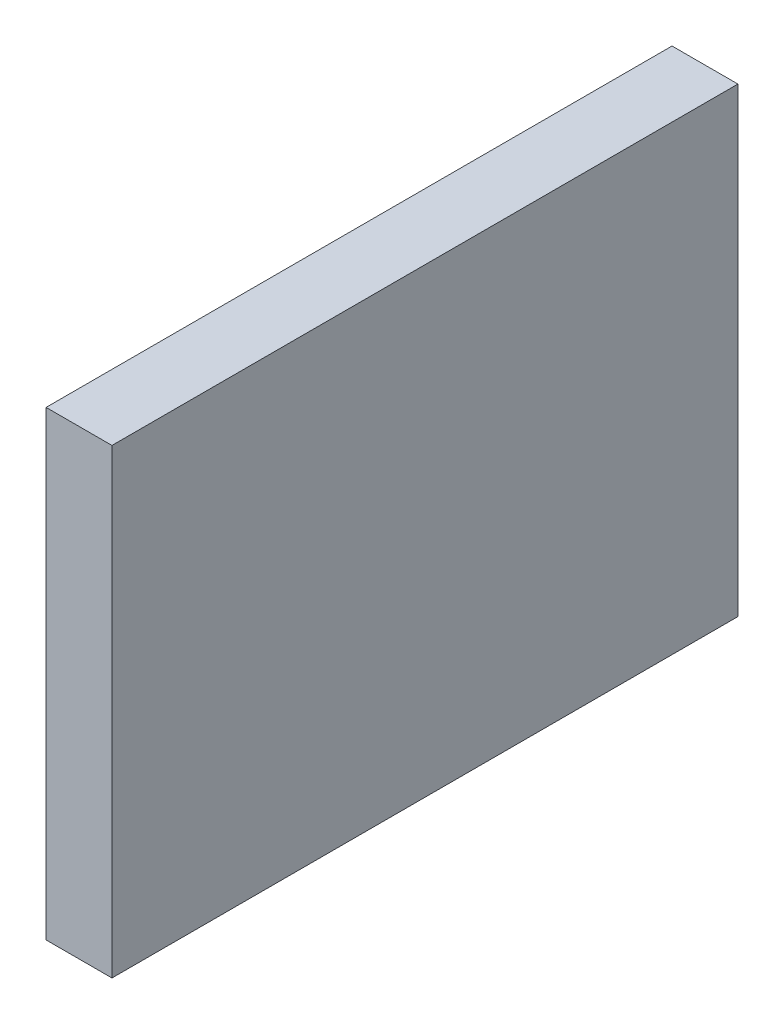
ISO-10303-21;
HEADER;
FILE_DESCRIPTION(('STEP AP214'),'2;1');
FILE_NAME('part.step','',(''),(''),'','','');
FILE_SCHEMA(('AUTOMOTIVE_DESIGN { 1 0 10303 214 1 1 1 1 }'));
ENDSEC;
DATA;
#1=APPLICATION_CONTEXT('core data for automotive mechanical design processes');
#2=APPLICATION_PROTOCOL_DEFINITION('international standard','automotive_design',2000,#1);
#3=PRODUCT_CONTEXT('',#1,'mechanical');
#4=PRODUCT('Part','Part','',(#3));
#5=PRODUCT_RELATED_PRODUCT_CATEGORY('part','',(#4));
#6=PRODUCT_DEFINITION_FORMATION('','',#4);
#7=PRODUCT_DEFINITION_CONTEXT('part definition',#1,'design');
#8=PRODUCT_DEFINITION('design','',#6,#7);
#9=PRODUCT_DEFINITION_SHAPE('','',#8);
#10=(LENGTH_UNIT() NAMED_UNIT(*) SI_UNIT(.MILLI.,.METRE.));
#11=(NAMED_UNIT(*) PLANE_ANGLE_UNIT() SI_UNIT($,.RADIAN.));
#12=(NAMED_UNIT(*) SI_UNIT($,.STERADIAN.) SOLID_ANGLE_UNIT());
#13=UNCERTAINTY_MEASURE_WITH_UNIT(LENGTH_MEASURE(1.E-05),#10,'distance_accuracy_value','');
#14=(GEOMETRIC_REPRESENTATION_CONTEXT(3) GLOBAL_UNCERTAINTY_ASSIGNED_CONTEXT((#13)) GLOBAL_UNIT_ASSIGNED_CONTEXT((#10,
#11,#12)) REPRESENTATION_CONTEXT('',''));
#15=CARTESIAN_POINT('',(0.,0.,0.));
#16=DIRECTION('',(0.,0.,1.));
#17=DIRECTION('',(1.,0.,0.));
#18=AXIS2_PLACEMENT_3D('',#15,#16,#17);
#19=CARTESIAN_POINT('',(0.999999999999999,7.,23.));
#20=DIRECTION('',(-1.,0.,0.));
#21=DIRECTION('',(0.,-1.,0.));
#22=AXIS2_PLACEMENT_3D('',#19,#20,#21);
#23=PLANE('',#22);
#24=DIRECTION('',(0.,0.,-1.));
#25=VECTOR('',#24,1.);
#26=CARTESIAN_POINT('',(1.,-7.,23.));
#27=LINE('',#26,#25);
#28=CARTESIAN_POINT('',(1.,-7.,23.));
#29=VERTEX_POINT('',#28);
#30=CARTESIAN_POINT('',(1.,-7.,4.00000000000001));
#31=VERTEX_POINT('',#30);
#32=EDGE_CURVE('E90',#29,#31,#27,.T.);
#33=ORIENTED_EDGE('',*,*,#32,.T.);
#34=DIRECTION('',(0.,1.,0.));
#35=VECTOR('',#34,1.);
#36=CARTESIAN_POINT('',(0.999999999999999,7.,4.));
#37=LINE('',#36,#35);
#38=CARTESIAN_POINT('',(0.999999999999999,7.,4.));
#39=VERTEX_POINT('',#38);
#40=EDGE_CURVE('E47',#31,#39,#37,.T.);
#41=ORIENTED_EDGE('',*,*,#40,.T.);
#42=DIRECTION('',(0.,0.,-1.));
#43=VECTOR('',#42,1.);
#44=CARTESIAN_POINT('',(0.999999999999999,7.,23.));
#45=LINE('',#44,#43);
#46=CARTESIAN_POINT('',(0.999999999999999,7.,23.));
#47=VERTEX_POINT('',#46);
#48=EDGE_CURVE('E11',#47,#39,#45,.T.);
#49=ORIENTED_EDGE('',*,*,#48,.F.);
#50=DIRECTION('',(0.,1.,0.));
#51=VECTOR('',#50,1.);
#52=CARTESIAN_POINT('',(0.999999999999999,7.,23.));
#53=LINE('',#52,#51);
#54=EDGE_CURVE('E99',#29,#47,#53,.T.);
#55=ORIENTED_EDGE('',*,*,#54,.F.);
#56=EDGE_LOOP('',(#33,#41,#49,#55));
#57=FACE_BOUND('',#56,.T.);
#58=ADVANCED_FACE('F33',(#57),#23,.F.);
#59=CARTESIAN_POINT('',(-1.,7.,23.));
#60=DIRECTION('',(0.,-1.,0.));
#61=DIRECTION('',(0.,0.,-1.));
#62=AXIS2_PLACEMENT_3D('',#59,#60,#61);
#63=PLANE('',#62);
#64=ORIENTED_EDGE('',*,*,#48,.T.);
#65=DIRECTION('',(-1.,0.,0.));
#66=VECTOR('',#65,1.);
#67=CARTESIAN_POINT('',(9.,7.,4.));
#68=LINE('',#67,#66);
#69=CARTESIAN_POINT('',(-1.,7.,4.));
#70=VERTEX_POINT('',#69);
#71=EDGE_CURVE('E79',#39,#70,#68,.T.);
#72=ORIENTED_EDGE('',*,*,#71,.T.);
#73=DIRECTION('',(0.,0.,-1.));
#74=VECTOR('',#73,1.);
#75=CARTESIAN_POINT('',(-1.,7.,23.));
#76=LINE('',#75,#74);
#77=CARTESIAN_POINT('',(-1.,7.,23.));
#78=VERTEX_POINT('',#77);
#79=EDGE_CURVE('E40',#78,#70,#76,.T.);
#80=ORIENTED_EDGE('',*,*,#79,.F.);
#81=DIRECTION('',(-1.,0.,0.));
#82=VECTOR('',#81,1.);
#83=CARTESIAN_POINT('',(-1.,7.,23.));
#84=LINE('',#83,#82);
#85=EDGE_CURVE('E97',#47,#78,#84,.T.);
#86=ORIENTED_EDGE('',*,*,#85,.F.);
#87=EDGE_LOOP('',(#64,#72,#80,#86));
#88=FACE_BOUND('',#87,.T.);
#89=ADVANCED_FACE('F103',(#88),#63,.F.);
#90=CARTESIAN_POINT('',(-1.,7.,23.));
#91=DIRECTION('',(1.,0.,0.));
#92=DIRECTION('',(0.,1.,0.));
#93=AXIS2_PLACEMENT_3D('',#90,#91,#92);
#94=PLANE('',#93);
#95=ORIENTED_EDGE('',*,*,#79,.T.);
#96=DIRECTION('',(0.,1.,0.));
#97=VECTOR('',#96,1.);
#98=CARTESIAN_POINT('',(-1.,7.,4.));
#99=LINE('',#98,#97);
#100=CARTESIAN_POINT('',(-0.999999999999999,-7.,4.));
#101=VERTEX_POINT('',#100);
#102=EDGE_CURVE('E74',#101,#70,#99,.T.);
#103=ORIENTED_EDGE('',*,*,#102,.F.);
#104=DIRECTION('',(0.,0.,-1.));
#105=VECTOR('',#104,1.);
#106=CARTESIAN_POINT('',(-0.999999999999999,-7.,23.));
#107=LINE('',#106,#105);
#108=CARTESIAN_POINT('',(-0.999999999999999,-7.,23.));
#109=VERTEX_POINT('',#108);
#110=EDGE_CURVE('E86',#109,#101,#107,.T.);
#111=ORIENTED_EDGE('',*,*,#110,.F.);
#112=DIRECTION('',(0.,-1.,0.));
#113=VECTOR('',#112,1.);
#114=CARTESIAN_POINT('',(-1.,7.,23.));
#115=LINE('',#114,#113);
#116=EDGE_CURVE('E95',#78,#109,#115,.T.);
#117=ORIENTED_EDGE('',*,*,#116,.F.);
#118=EDGE_LOOP('',(#95,#103,#111,#117));
#119=FACE_BOUND('',#118,.T.);
#120=ADVANCED_FACE('F84',(#119),#94,.F.);
#121=CARTESIAN_POINT('',(-0.999999999999999,-7.,23.));
#122=DIRECTION('',(0.,1.,0.));
#123=DIRECTION('',(0.,0.,1.));
#124=AXIS2_PLACEMENT_3D('',#121,#122,#123);
#125=PLANE('',#124);
#126=ORIENTED_EDGE('',*,*,#110,.T.);
#127=DIRECTION('',(-1.,0.,0.));
#128=VECTOR('',#127,1.);
#129=CARTESIAN_POINT('',(9.,-7.,4.));
#130=LINE('',#129,#128);
#131=EDGE_CURVE('E71',#31,#101,#130,.T.);
#132=ORIENTED_EDGE('',*,*,#131,.F.);
#133=ORIENTED_EDGE('',*,*,#32,.F.);
#134=DIRECTION('',(1.,0.,0.));
#135=VECTOR('',#134,1.);
#136=CARTESIAN_POINT('',(-0.999999999999999,-7.,23.));
#137=LINE('',#136,#135);
#138=EDGE_CURVE('E55',#109,#29,#137,.T.);
#139=ORIENTED_EDGE('',*,*,#138,.F.);
#140=EDGE_LOOP('',(#126,#132,#133,#139));
#141=FACE_BOUND('',#140,.T.);
#142=ADVANCED_FACE('F89',(#141),#125,.F.);
#143=CARTESIAN_POINT('',(0.,0.,23.));
#144=DIRECTION('',(0.,0.,1.));
#145=DIRECTION('',(1.,0.,0.));
#146=AXIS2_PLACEMENT_3D('',#143,#144,#145);
#147=PLANE('',#146);
#148=ORIENTED_EDGE('',*,*,#54,.T.);
#149=ORIENTED_EDGE('',*,*,#85,.T.);
#150=ORIENTED_EDGE('',*,*,#116,.T.);
#151=ORIENTED_EDGE('',*,*,#138,.T.);
#152=EDGE_LOOP('',(#148,#149,#150,#151));
#153=FACE_BOUND('',#152,.T.);
#154=ADVANCED_FACE('F107',(#153),#147,.T.);
#155=CARTESIAN_POINT('',(9.,7.,4.));
#156=DIRECTION('',(0.,0.,1.));
#157=DIRECTION('',(0.,-1.,0.));
#158=AXIS2_PLACEMENT_3D('',#155,#156,#157);
#159=PLANE('',#158);
#160=ORIENTED_EDGE('',*,*,#131,.T.);
#161=ORIENTED_EDGE('',*,*,#102,.T.);
#162=ORIENTED_EDGE('',*,*,#71,.F.);
#163=ORIENTED_EDGE('',*,*,#40,.F.);
#164=EDGE_LOOP('',(#160,#161,#162,#163));
#165=FACE_BOUND('',#164,.T.);
#166=ADVANCED_FACE('F73',(#165),#159,.F.);
#167=CLOSED_SHELL('',(#58,#89,#120,#142,#154,#166));
#168=MANIFOLD_SOLID_BREP('B2',#167);
#169=ADVANCED_BREP_SHAPE_REPRESENTATION('',(#18,#168),#14);
#170=SHAPE_DEFINITION_REPRESENTATION(#9,#169);
ENDSEC;
END-ISO-10303-21;
